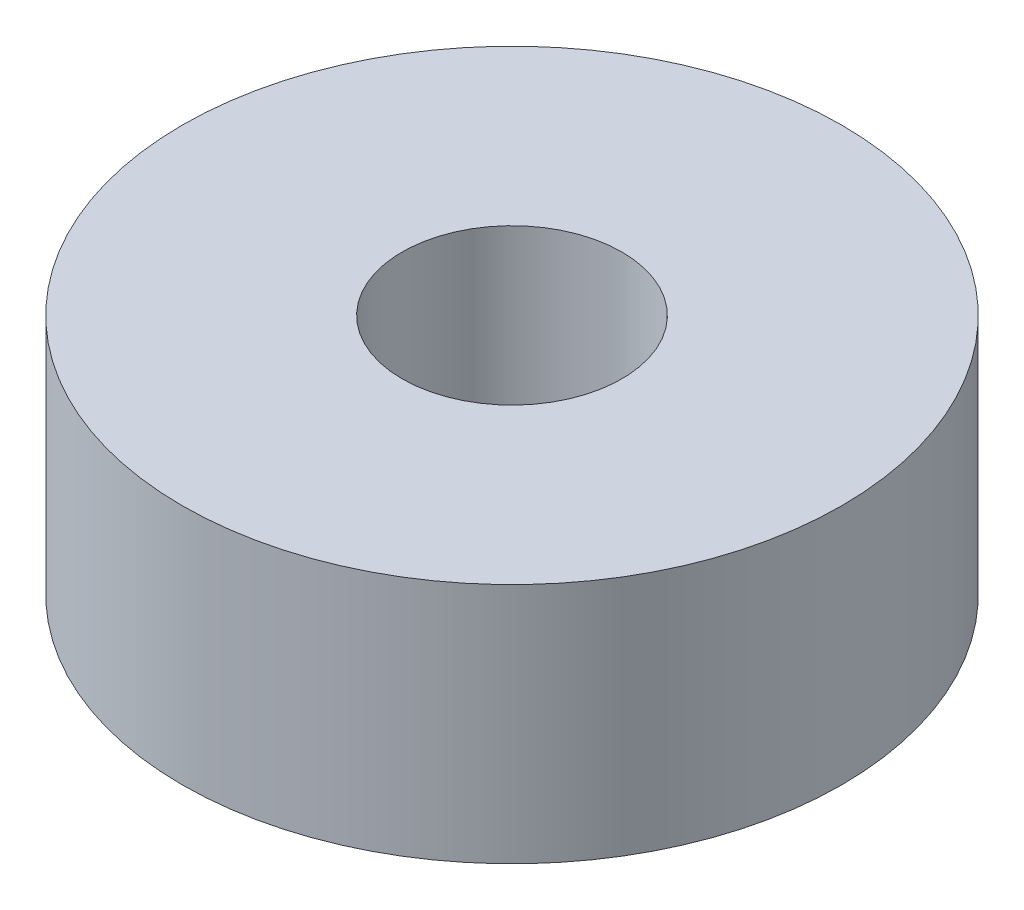
ISO-10303-21;
HEADER;
FILE_DESCRIPTION(('STEP AP214'),'2;1');
FILE_NAME('part.step','',(''),(''),'','','');
FILE_SCHEMA(('AUTOMOTIVE_DESIGN { 1 0 10303 214 1 1 1 1 }'));
ENDSEC;
DATA;
#1=APPLICATION_CONTEXT('core data for automotive mechanical design processes');
#2=APPLICATION_PROTOCOL_DEFINITION('international standard','automotive_design',2000,#1);
#3=PRODUCT_CONTEXT('',#1,'mechanical');
#4=PRODUCT('Part','Part','',(#3));
#5=PRODUCT_RELATED_PRODUCT_CATEGORY('part','',(#4));
#6=PRODUCT_DEFINITION_FORMATION('','',#4);
#7=PRODUCT_DEFINITION_CONTEXT('part definition',#1,'design');
#8=PRODUCT_DEFINITION('design','',#6,#7);
#9=PRODUCT_DEFINITION_SHAPE('','',#8);
#10=(LENGTH_UNIT() NAMED_UNIT(*) SI_UNIT(.MILLI.,.METRE.));
#11=(NAMED_UNIT(*) PLANE_ANGLE_UNIT() SI_UNIT($,.RADIAN.));
#12=(NAMED_UNIT(*) SI_UNIT($,.STERADIAN.) SOLID_ANGLE_UNIT());
#13=UNCERTAINTY_MEASURE_WITH_UNIT(LENGTH_MEASURE(1.E-05),#10,'distance_accuracy_value','');
#14=(GEOMETRIC_REPRESENTATION_CONTEXT(3) GLOBAL_UNCERTAINTY_ASSIGNED_CONTEXT((#13)) GLOBAL_UNIT_ASSIGNED_CONTEXT((#10,
#11,#12)) REPRESENTATION_CONTEXT('',''));
#15=CARTESIAN_POINT('',(0.,0.,0.));
#16=DIRECTION('',(0.,0.,1.));
#17=DIRECTION('',(1.,0.,0.));
#18=AXIS2_PLACEMENT_3D('',#15,#16,#17);
#19=CARTESIAN_POINT('',(0.,13.97,0.));
#20=DIRECTION('',(0.,1.,0.));
#21=DIRECTION('',(0.,0.,1.));
#22=AXIS2_PLACEMENT_3D('',#19,#20,#21);
#23=PLANE('',#22);
#24=CARTESIAN_POINT('',(0.,13.97,0.));
#25=DIRECTION('',(0.,1.,0.));
#26=DIRECTION('',(0.,0.,1.));
#27=AXIS2_PLACEMENT_3D('',#24,#25,#26);
#28=CIRCLE('',#27,19.05);
#29=CARTESIAN_POINT('',(0.,13.97,19.05));
#30=VERTEX_POINT('',#29);
#31=EDGE_CURVE('E10',#30,#30,#28,.T.);
#32=ORIENTED_EDGE('',*,*,#31,.T.);
#33=EDGE_LOOP('',(#32));
#34=FACE_BOUND('',#33,.T.);
#35=CARTESIAN_POINT('',(0.,13.97,0.));
#36=DIRECTION('',(0.,1.,0.));
#37=DIRECTION('',(0.,0.,1.));
#38=AXIS2_PLACEMENT_3D('',#35,#36,#37);
#39=CIRCLE('',#38,6.35);
#40=CARTESIAN_POINT('',(0.,13.97,6.35));
#41=VERTEX_POINT('',#40);
#42=EDGE_CURVE('E42',#41,#41,#39,.T.);
#43=ORIENTED_EDGE('',*,*,#42,.F.);
#44=EDGE_LOOP('',(#43));
#45=FACE_BOUND('',#44,.T.);
#46=ADVANCED_FACE('F31',(#34,#45),#23,.T.);
#47=CARTESIAN_POINT('',(0.,0.,0.));
#48=DIRECTION('',(0.,1.,0.));
#49=DIRECTION('',(0.,0.,1.));
#50=AXIS2_PLACEMENT_3D('',#47,#48,#49);
#51=PLANE('',#50);
#52=CARTESIAN_POINT('',(0.,0.,0.));
#53=DIRECTION('',(0.,1.,0.));
#54=DIRECTION('',(0.,0.,1.));
#55=AXIS2_PLACEMENT_3D('',#52,#53,#54);
#56=CIRCLE('',#55,19.05);
#57=CARTESIAN_POINT('',(0.,0.,19.05));
#58=VERTEX_POINT('',#57);
#59=EDGE_CURVE('E35',#58,#58,#56,.T.);
#60=ORIENTED_EDGE('',*,*,#59,.F.);
#61=EDGE_LOOP('',(#60));
#62=FACE_BOUND('',#61,.T.);
#63=CARTESIAN_POINT('',(0.,0.,0.));
#64=DIRECTION('',(0.,1.,0.));
#65=DIRECTION('',(0.,0.,1.));
#66=AXIS2_PLACEMENT_3D('',#63,#64,#65);
#67=CIRCLE('',#66,6.35);
#68=CARTESIAN_POINT('',(0.,0.,6.35));
#69=VERTEX_POINT('',#68);
#70=EDGE_CURVE('E44',#69,#69,#67,.T.);
#71=ORIENTED_EDGE('',*,*,#70,.T.);
#72=EDGE_LOOP('',(#71));
#73=FACE_BOUND('',#72,.T.);
#74=ADVANCED_FACE('F54',(#62,#73),#51,.F.);
#75=CARTESIAN_POINT('',(0.,13.97,0.));
#76=DIRECTION('',(0.,-1.,0.));
#77=DIRECTION('',(0.,0.,-1.));
#78=AXIS2_PLACEMENT_3D('',#75,#76,#77);
#79=CYLINDRICAL_SURFACE('',#78,19.05);
#80=ORIENTED_EDGE('',*,*,#31,.F.);
#81=EDGE_LOOP('',(#80));
#82=FACE_BOUND('',#81,.T.);
#83=ORIENTED_EDGE('',*,*,#59,.T.);
#84=EDGE_LOOP('',(#83));
#85=FACE_BOUND('',#84,.T.);
#86=ADVANCED_FACE('F33',(#82,#85),#79,.T.);
#87=CARTESIAN_POINT('',(0.,13.97,0.));
#88=DIRECTION('',(0.,-1.,0.));
#89=DIRECTION('',(0.,0.,-1.));
#90=AXIS2_PLACEMENT_3D('',#87,#88,#89);
#91=CYLINDRICAL_SURFACE('',#90,6.35);
#92=ORIENTED_EDGE('',*,*,#42,.T.);
#93=EDGE_LOOP('',(#92));
#94=FACE_BOUND('',#93,.T.);
#95=ORIENTED_EDGE('',*,*,#70,.F.);
#96=EDGE_LOOP('',(#95));
#97=FACE_BOUND('',#96,.T.);
#98=ADVANCED_FACE('F50',(#94,#97),#91,.F.);
#99=CLOSED_SHELL('',(#46,#74,#86,#98));
#100=MANIFOLD_SOLID_BREP('B2',#99);
#101=ADVANCED_BREP_SHAPE_REPRESENTATION('',(#18,#100),#14);
#102=SHAPE_DEFINITION_REPRESENTATION(#9,#101);
ENDSEC;
END-ISO-10303-21;
